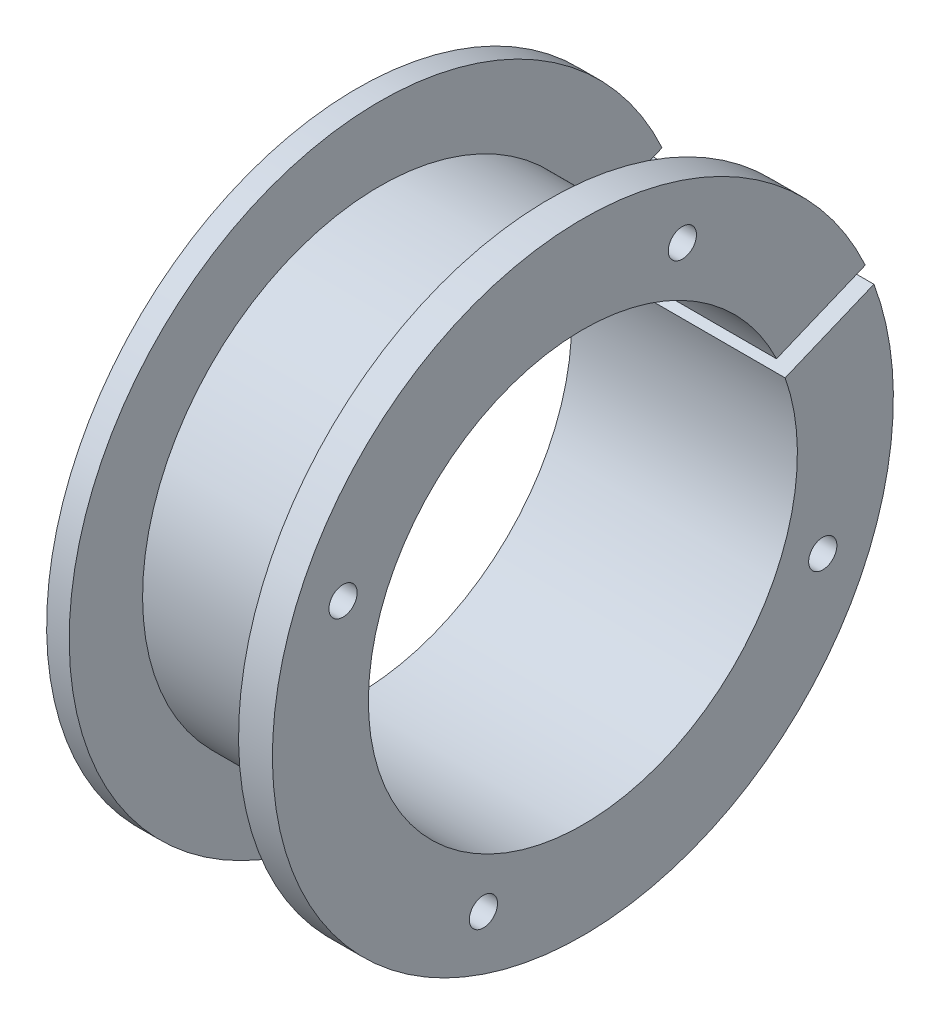
ISO-10303-21;
HEADER;
FILE_DESCRIPTION(('STEP AP214'),'2;1');
FILE_NAME('part.step','',(''),(''),'','','');
FILE_SCHEMA(('AUTOMOTIVE_DESIGN { 1 0 10303 214 1 1 1 1 }'));
ENDSEC;
DATA;
#1=APPLICATION_CONTEXT('core data for automotive mechanical design processes');
#2=APPLICATION_PROTOCOL_DEFINITION('international standard','automotive_design',2000,#1);
#3=PRODUCT_CONTEXT('',#1,'mechanical');
#4=PRODUCT('Part','Part','',(#3));
#5=PRODUCT_RELATED_PRODUCT_CATEGORY('part','',(#4));
#6=PRODUCT_DEFINITION_FORMATION('','',#4);
#7=PRODUCT_DEFINITION_CONTEXT('part definition',#1,'design');
#8=PRODUCT_DEFINITION('design','',#6,#7);
#9=PRODUCT_DEFINITION_SHAPE('','',#8);
#10=(LENGTH_UNIT() NAMED_UNIT(*) SI_UNIT(.MILLI.,.METRE.));
#11=(NAMED_UNIT(*) PLANE_ANGLE_UNIT() SI_UNIT($,.RADIAN.));
#12=(NAMED_UNIT(*) SI_UNIT($,.STERADIAN.) SOLID_ANGLE_UNIT());
#13=UNCERTAINTY_MEASURE_WITH_UNIT(LENGTH_MEASURE(1.E-05),#10,'distance_accuracy_value','');
#14=(GEOMETRIC_REPRESENTATION_CONTEXT(3) GLOBAL_UNCERTAINTY_ASSIGNED_CONTEXT((#13)) GLOBAL_UNIT_ASSIGNED_CONTEXT((#10,
#11,#12)) REPRESENTATION_CONTEXT('',''));
#15=CARTESIAN_POINT('',(0.,0.,0.));
#16=DIRECTION('',(0.,0.,1.));
#17=DIRECTION('',(1.,0.,0.));
#18=AXIS2_PLACEMENT_3D('',#15,#16,#17);
#19=CARTESIAN_POINT('',(0.,19.,0.));
#20=DIRECTION('',(1.,0.,0.));
#21=DIRECTION('',(0.,0.,-1.));
#22=AXIS2_PLACEMENT_3D('',#19,#20,#21);
#23=PLANE('',#22);
#24=DIRECTION('',(0.,0.382317796738247,-0.92403089899484));
#25=VECTOR('',#24,1.);
#26=CARTESIAN_POINT('',(0.,11.4377703092966,-25.0285319256198));
#27=LINE('',#26,#25);
#28=CARTESIAN_POINT('',(0.,8.17800106525573,-17.1499358184419));
#29=VERTEX_POINT('',#28);
#30=CARTESIAN_POINT('',(0.,11.43081677718,-25.0117258062402));
#31=VERTEX_POINT('',#30);
#32=EDGE_CURVE('E57',#29,#31,#27,.T.);
#33=ORIENTED_EDGE('',*,*,#32,.T.);
#34=CARTESIAN_POINT('',(0.,0.,0.));
#35=DIRECTION('',(1.,0.,0.));
#36=DIRECTION('',(0.,0.,-1.));
#37=AXIS2_PLACEMENT_3D('',#34,#35,#36);
#38=CIRCLE('',#37,27.5);
#39=CARTESIAN_POINT('',(0.,9.58275497919029,-25.7763613997167));
#40=VERTEX_POINT('',#39);
#41=EDGE_CURVE('E11',#31,#40,#38,.T.);
#42=ORIENTED_EDGE('',*,*,#41,.T.);
#43=DIRECTION('',(0.,-0.382317796738246,0.92403089899484));
#44=VECTOR('',#43,1.);
#45=CARTESIAN_POINT('',(0.,9.58970851130696,-25.7931675190963));
#46=LINE('',#45,#44);
#47=CARTESIAN_POINT('',(0.,6.3299392672661,-17.9145714119184));
#48=VERTEX_POINT('',#47);
#49=EDGE_CURVE('E99',#40,#48,#46,.T.);
#50=ORIENTED_EDGE('',*,*,#49,.T.);
#51=CARTESIAN_POINT('',(0.,0.,0.));
#52=DIRECTION('',(1.,0.,0.));
#53=DIRECTION('',(0.,0.,-1.));
#54=AXIS2_PLACEMENT_3D('',#51,#52,#53);
#55=CIRCLE('',#54,19.);
#56=EDGE_CURVE('E110',#29,#48,#55,.T.);
#57=ORIENTED_EDGE('',*,*,#56,.F.);
#58=EDGE_LOOP('',(#33,#42,#50,#57));
#59=FACE_BOUND('',#58,.T.);
#60=CARTESIAN_POINT('',(0.,-21.2457444909825,8.81012718545448));
#61=DIRECTION('',(1.,0.,0.));
#62=DIRECTION('',(0.,0.,-1.));
#63=AXIS2_PLACEMENT_3D('',#60,#61,#62);
#64=CIRCLE('',#63,1.24999999999999);
#65=CARTESIAN_POINT('',(0.,-21.2457444909825,7.56012718545449));
#66=VERTEX_POINT('',#65);
#67=EDGE_CURVE('E152',#66,#66,#64,.T.);
#68=ORIENTED_EDGE('',*,*,#67,.F.);
#69=EDGE_LOOP('',(#68));
#70=FACE_BOUND('',#69,.T.);
#71=CARTESIAN_POINT('',(0.,-8.81012718545447,-21.2457444909825));
#72=DIRECTION('',(1.,0.,0.));
#73=DIRECTION('',(0.,0.,-1.));
#74=AXIS2_PLACEMENT_3D('',#71,#72,#73);
#75=CIRCLE('',#74,1.24999999999999);
#76=CARTESIAN_POINT('',(0.,-8.81012718545447,-22.4957444909825));
#77=VERTEX_POINT('',#76);
#78=EDGE_CURVE('E143',#77,#77,#75,.T.);
#79=ORIENTED_EDGE('',*,*,#78,.F.);
#80=EDGE_LOOP('',(#79));
#81=FACE_BOUND('',#80,.T.);
#82=CARTESIAN_POINT('',(0.,21.2457444909826,-8.81012718545444));
#83=DIRECTION('',(1.,0.,0.));
#84=DIRECTION('',(0.,0.,-1.));
#85=AXIS2_PLACEMENT_3D('',#82,#83,#84);
#86=CIRCLE('',#85,1.24999999999999);
#87=CARTESIAN_POINT('',(0.,21.2457444909826,-10.0601271854544));
#88=VERTEX_POINT('',#87);
#89=EDGE_CURVE('E140',#88,#88,#86,.T.);
#90=ORIENTED_EDGE('',*,*,#89,.F.);
#91=EDGE_LOOP('',(#90));
#92=FACE_BOUND('',#91,.T.);
#93=CARTESIAN_POINT('',(0.,8.81012718545446,21.2457444909826));
#94=DIRECTION('',(1.,0.,0.));
#95=DIRECTION('',(0.,0.,-1.));
#96=AXIS2_PLACEMENT_3D('',#93,#94,#95);
#97=CIRCLE('',#96,1.24999999999999);
#98=CARTESIAN_POINT('',(0.,8.81012718545446,19.9957444909826));
#99=VERTEX_POINT('',#98);
#100=EDGE_CURVE('E120',#99,#99,#97,.T.);
#101=ORIENTED_EDGE('',*,*,#100,.F.);
#102=EDGE_LOOP('',(#101));
#103=FACE_BOUND('',#102,.T.);
#104=ADVANCED_FACE('F33',(#59,#70,#81,#92,#103),#23,.T.);
#105=CARTESIAN_POINT('',(0.,0.,0.));
#106=DIRECTION('',(1.,0.,0.));
#107=DIRECTION('',(0.,0.,-1.));
#108=AXIS2_PLACEMENT_3D('',#105,#106,#107);
#109=CYLINDRICAL_SURFACE('',#108,27.5);
#110=DIRECTION('',(1.,0.,0.));
#111=VECTOR('',#110,1.);
#112=CARTESIAN_POINT('',(0.,11.43081677718,-25.0117258062402));
#113=LINE('',#112,#111);
#114=CARTESIAN_POINT('',(-3.,11.43081677718,-25.0117258062402));
#115=VERTEX_POINT('',#114);
#116=EDGE_CURVE('E156',#115,#31,#113,.T.);
#117=ORIENTED_EDGE('',*,*,#116,.F.);
#118=CARTESIAN_POINT('',(-3.,0.,0.));
#119=DIRECTION('',(1.,0.,0.));
#120=DIRECTION('',(0.,0.,-1.));
#121=AXIS2_PLACEMENT_3D('',#118,#119,#120);
#122=CIRCLE('',#121,27.5);
#123=CARTESIAN_POINT('',(-3.,9.5827549791903,-25.7763613997167));
#124=VERTEX_POINT('',#123);
#125=EDGE_CURVE('E41',#115,#124,#122,.T.);
#126=ORIENTED_EDGE('',*,*,#125,.T.);
#127=DIRECTION('',(1.,0.,0.));
#128=VECTOR('',#127,1.);
#129=CARTESIAN_POINT('',(0.,9.58275497919029,-25.7763613997167));
#130=LINE('',#129,#128);
#131=EDGE_CURVE('E166',#40,#124,#130,.F.);
#132=ORIENTED_EDGE('',*,*,#131,.F.);
#133=ORIENTED_EDGE('',*,*,#41,.F.);
#134=EDGE_LOOP('',(#117,#126,#132,#133));
#135=FACE_BOUND('',#134,.T.);
#136=ADVANCED_FACE('F182',(#135),#109,.T.);
#137=CARTESIAN_POINT('',(-3.,27.5,0.));
#138=DIRECTION('',(-1.,0.,0.));
#139=DIRECTION('',(0.,0.,1.));
#140=AXIS2_PLACEMENT_3D('',#137,#138,#139);
#141=PLANE('',#140);
#142=DIRECTION('',(0.,0.382317796738247,-0.92403089899484));
#143=VECTOR('',#142,1.);
#144=CARTESIAN_POINT('',(-3.,4.94362058582151,-9.33270228236041));
#145=LINE('',#144,#143);
#146=CARTESIAN_POINT('',(-3.,8.94359665963467,-19.0003178602299));
#147=VERTEX_POINT('',#146);
#148=EDGE_CURVE('E158',#147,#115,#145,.T.);
#149=ORIENTED_EDGE('',*,*,#148,.F.);
#150=CARTESIAN_POINT('',(-3.,0.,0.));
#151=DIRECTION('',(1.,0.,0.));
#152=DIRECTION('',(0.,0.,-1.));
#153=AXIS2_PLACEMENT_3D('',#150,#151,#152);
#154=CIRCLE('',#153,21.);
#155=CARTESIAN_POINT('',(-3.,7.095534861645,-19.7649534537064));
#156=VERTEX_POINT('',#155);
#157=EDGE_CURVE('E133',#147,#156,#154,.T.);
#158=ORIENTED_EDGE('',*,*,#157,.T.);
#159=DIRECTION('',(0.,-0.382317796738246,0.924030898994841));
#160=VECTOR('',#159,1.);
#161=CARTESIAN_POINT('',(-3.,3.09555878783184,-10.0973378758369));
#162=LINE('',#161,#160);
#163=EDGE_CURVE('E168',#124,#156,#162,.T.);
#164=ORIENTED_EDGE('',*,*,#163,.F.);
#165=ORIENTED_EDGE('',*,*,#125,.F.);
#166=EDGE_LOOP('',(#149,#158,#164,#165));
#167=FACE_BOUND('',#166,.T.);
#168=CARTESIAN_POINT('',(-3.,-21.2457444909825,8.81012718545448));
#169=DIRECTION('',(-1.,0.,0.));
#170=DIRECTION('',(0.,0.,1.));
#171=AXIS2_PLACEMENT_3D('',#168,#169,#170);
#172=CIRCLE('',#171,1.24999999999999);
#173=CARTESIAN_POINT('',(-3.,-21.2457444909825,10.0601271854545));
#174=VERTEX_POINT('',#173);
#175=EDGE_CURVE('E36',#174,#174,#172,.T.);
#176=ORIENTED_EDGE('',*,*,#175,.F.);
#177=EDGE_LOOP('',(#176));
#178=FACE_BOUND('',#177,.T.);
#179=CARTESIAN_POINT('',(-3.,-8.81012718545447,-21.2457444909825));
#180=DIRECTION('',(-1.,0.,0.));
#181=DIRECTION('',(0.,0.,1.));
#182=AXIS2_PLACEMENT_3D('',#179,#180,#181);
#183=CIRCLE('',#182,1.24999999999999);
#184=CARTESIAN_POINT('',(-3.,-8.81012718545447,-19.9957444909825));
#185=VERTEX_POINT('',#184);
#186=EDGE_CURVE('E141',#185,#185,#183,.T.);
#187=ORIENTED_EDGE('',*,*,#186,.F.);
#188=EDGE_LOOP('',(#187));
#189=FACE_BOUND('',#188,.T.);
#190=CARTESIAN_POINT('',(-3.,21.2457444909826,-8.81012718545444));
#191=DIRECTION('',(-1.,0.,0.));
#192=DIRECTION('',(0.,0.,1.));
#193=AXIS2_PLACEMENT_3D('',#190,#191,#192);
#194=CIRCLE('',#193,1.24999999999999);
#195=CARTESIAN_POINT('',(-3.,21.2457444909826,-7.56012718545446));
#196=VERTEX_POINT('',#195);
#197=EDGE_CURVE('E138',#196,#196,#194,.T.);
#198=ORIENTED_EDGE('',*,*,#197,.F.);
#199=EDGE_LOOP('',(#198));
#200=FACE_BOUND('',#199,.T.);
#201=CARTESIAN_POINT('',(-3.,8.81012718545446,21.2457444909826));
#202=DIRECTION('',(-1.,0.,0.));
#203=DIRECTION('',(0.,0.,1.));
#204=AXIS2_PLACEMENT_3D('',#201,#202,#203);
#205=CIRCLE('',#204,1.24999999999999);
#206=CARTESIAN_POINT('',(-3.,8.81012718545446,22.4957444909826));
#207=VERTEX_POINT('',#206);
#208=EDGE_CURVE('E115',#207,#207,#205,.T.);
#209=ORIENTED_EDGE('',*,*,#208,.F.);
#210=EDGE_LOOP('',(#209));
#211=FACE_BOUND('',#210,.T.);
#212=ADVANCED_FACE('F188',(#167,#178,#189,#200,#211),#141,.T.);
#213=CARTESIAN_POINT('',(0.,0.,0.));
#214=DIRECTION('',(1.,0.,0.));
#215=DIRECTION('',(0.,0.,-1.));
#216=AXIS2_PLACEMENT_3D('',#213,#214,#215);
#217=CYLINDRICAL_SURFACE('',#216,21.);
#218=DIRECTION('',(1.,0.,0.));
#219=VECTOR('',#218,1.);
#220=CARTESIAN_POINT('',(0.,8.94359665963467,-19.0003178602299));
#221=LINE('',#220,#219);
#222=CARTESIAN_POINT('',(-18.,8.94359665963467,-19.0003178602299));
#223=VERTEX_POINT('',#222);
#224=EDGE_CURVE('E160',#223,#147,#221,.T.);
#225=ORIENTED_EDGE('',*,*,#224,.F.);
#226=CARTESIAN_POINT('',(-18.,0.,0.));
#227=DIRECTION('',(1.,0.,0.));
#228=DIRECTION('',(0.,0.,-1.));
#229=AXIS2_PLACEMENT_3D('',#226,#227,#228);
#230=CIRCLE('',#229,21.);
#231=CARTESIAN_POINT('',(-18.,7.09553486164499,-19.7649534537064));
#232=VERTEX_POINT('',#231);
#233=EDGE_CURVE('E130',#223,#232,#230,.T.);
#234=ORIENTED_EDGE('',*,*,#233,.T.);
#235=DIRECTION('',(1.,0.,0.));
#236=VECTOR('',#235,1.);
#237=CARTESIAN_POINT('',(0.,7.095534861645,-19.7649534537064));
#238=LINE('',#237,#236);
#239=EDGE_CURVE('E170',#156,#232,#238,.F.);
#240=ORIENTED_EDGE('',*,*,#239,.F.);
#241=ORIENTED_EDGE('',*,*,#157,.F.);
#242=EDGE_LOOP('',(#225,#234,#240,#241));
#243=FACE_BOUND('',#242,.T.);
#244=ADVANCED_FACE('F193',(#243),#217,.T.);
#245=CARTESIAN_POINT('',(-18.,21.,0.));
#246=DIRECTION('',(1.,0.,0.));
#247=DIRECTION('',(0.,0.,-1.));
#248=AXIS2_PLACEMENT_3D('',#245,#246,#247);
#249=PLANE('',#248);
#250=DIRECTION('',(0.,-0.382317796738247,0.92403089899484));
#251=VECTOR('',#250,1.);
#252=CARTESIAN_POINT('',(-18.,3.99353575075339,-7.0364248091189));
#253=LINE('',#252,#251);
#254=CARTESIAN_POINT('',(-18.,11.43081677718,-25.0117258062402));
#255=VERTEX_POINT('',#254);
#256=EDGE_CURVE('E162',#255,#223,#253,.T.);
#257=ORIENTED_EDGE('',*,*,#256,.F.);
#258=CARTESIAN_POINT('',(-18.,0.,0.));
#259=DIRECTION('',(1.,0.,0.));
#260=DIRECTION('',(0.,0.,-1.));
#261=AXIS2_PLACEMENT_3D('',#258,#259,#260);
#262=CIRCLE('',#261,27.5);
#263=CARTESIAN_POINT('',(-18.,9.58275497919029,-25.7763613997167));
#264=VERTEX_POINT('',#263);
#265=EDGE_CURVE('E127',#255,#264,#262,.T.);
#266=ORIENTED_EDGE('',*,*,#265,.T.);
#267=DIRECTION('',(0.,0.382317796738246,-0.924030898994841));
#268=VECTOR('',#267,1.);
#269=CARTESIAN_POINT('',(-18.,2.14547395276372,-7.80106040259537));
#270=LINE('',#269,#268);
#271=EDGE_CURVE('E172',#232,#264,#270,.T.);
#272=ORIENTED_EDGE('',*,*,#271,.F.);
#273=ORIENTED_EDGE('',*,*,#233,.F.);
#274=EDGE_LOOP('',(#257,#266,#272,#273));
#275=FACE_BOUND('',#274,.T.);
#276=ADVANCED_FACE('F199',(#275),#249,.T.);
#277=CARTESIAN_POINT('',(0.,0.,0.));
#278=DIRECTION('',(1.,0.,0.));
#279=DIRECTION('',(0.,0.,-1.));
#280=AXIS2_PLACEMENT_3D('',#277,#278,#279);
#281=CYLINDRICAL_SURFACE('',#280,27.5);
#282=DIRECTION('',(1.,0.,0.));
#283=VECTOR('',#282,1.);
#284=CARTESIAN_POINT('',(0.,11.43081677718,-25.0117258062402));
#285=LINE('',#284,#283);
#286=CARTESIAN_POINT('',(-20.,11.43081677718,-25.0117258062402));
#287=VERTEX_POINT('',#286);
#288=EDGE_CURVE('E164',#287,#255,#285,.T.);
#289=ORIENTED_EDGE('',*,*,#288,.F.);
#290=CARTESIAN_POINT('',(-20.,0.,0.));
#291=DIRECTION('',(1.,0.,0.));
#292=DIRECTION('',(0.,0.,-1.));
#293=AXIS2_PLACEMENT_3D('',#290,#291,#292);
#294=CIRCLE('',#293,27.5);
#295=CARTESIAN_POINT('',(-20.,9.5827549791903,-25.7763613997167));
#296=VERTEX_POINT('',#295);
#297=EDGE_CURVE('E117',#287,#296,#294,.T.);
#298=ORIENTED_EDGE('',*,*,#297,.T.);
#299=DIRECTION('',(1.,0.,0.));
#300=VECTOR('',#299,1.);
#301=CARTESIAN_POINT('',(0.,9.58275497919029,-25.7763613997167));
#302=LINE('',#301,#300);
#303=EDGE_CURVE('E174',#264,#296,#302,.F.);
#304=ORIENTED_EDGE('',*,*,#303,.F.);
#305=ORIENTED_EDGE('',*,*,#265,.F.);
#306=EDGE_LOOP('',(#289,#298,#304,#305));
#307=FACE_BOUND('',#306,.T.);
#308=ADVANCED_FACE('F203',(#307),#281,.T.);
#309=CARTESIAN_POINT('',(-20.,27.5,0.));
#310=DIRECTION('',(-1.,0.,0.));
#311=DIRECTION('',(0.,0.,1.));
#312=AXIS2_PLACEMENT_3D('',#309,#310,#311);
#313=PLANE('',#312);
#314=DIRECTION('',(0.,0.382317796738247,-0.92403089899484));
#315=VECTOR('',#314,1.);
#316=CARTESIAN_POINT('',(-20.,11.4377703092966,-25.0285319256198));
#317=LINE('',#316,#315);
#318=CARTESIAN_POINT('',(-20.,8.17800106525577,-17.1499358184419));
#319=VERTEX_POINT('',#318);
#320=EDGE_CURVE('E178',#319,#287,#317,.T.);
#321=ORIENTED_EDGE('',*,*,#320,.F.);
#322=CARTESIAN_POINT('',(-20.,0.,0.));
#323=DIRECTION('',(1.,0.,0.));
#324=DIRECTION('',(0.,0.,-1.));
#325=AXIS2_PLACEMENT_3D('',#322,#323,#324);
#326=CIRCLE('',#325,19.);
#327=CARTESIAN_POINT('',(-20.,6.32993926726608,-17.9145714119184));
#328=VERTEX_POINT('',#327);
#329=EDGE_CURVE('E114',#319,#328,#326,.T.);
#330=ORIENTED_EDGE('',*,*,#329,.T.);
#331=DIRECTION('',(0.,-0.382317796738246,0.92403089899484));
#332=VECTOR('',#331,1.);
#333=CARTESIAN_POINT('',(-20.,9.58970851130696,-25.7931675190963));
#334=LINE('',#333,#332);
#335=EDGE_CURVE('E49',#296,#328,#334,.T.);
#336=ORIENTED_EDGE('',*,*,#335,.F.);
#337=ORIENTED_EDGE('',*,*,#297,.F.);
#338=EDGE_LOOP('',(#321,#330,#336,#337));
#339=FACE_BOUND('',#338,.T.);
#340=ADVANCED_FACE('F207',(#339),#313,.T.);
#341=CARTESIAN_POINT('',(0.,0.,0.));
#342=DIRECTION('',(1.,0.,0.));
#343=DIRECTION('',(0.,0.,-1.));
#344=AXIS2_PLACEMENT_3D('',#341,#342,#343);
#345=CYLINDRICAL_SURFACE('',#344,19.);
#346=DIRECTION('',(-1.,0.,0.));
#347=VECTOR('',#346,1.);
#348=CARTESIAN_POINT('',(0.,8.17800106525577,-17.1499358184419));
#349=LINE('',#348,#347);
#350=EDGE_CURVE('E105',#29,#319,#349,.T.);
#351=ORIENTED_EDGE('',*,*,#350,.F.);
#352=ORIENTED_EDGE('',*,*,#56,.T.);
#353=DIRECTION('',(-1.,0.,0.));
#354=VECTOR('',#353,1.);
#355=CARTESIAN_POINT('',(0.,6.3299392672661,-17.9145714119184));
#356=LINE('',#355,#354);
#357=EDGE_CURVE('E96',#48,#328,#356,.T.);
#358=ORIENTED_EDGE('',*,*,#357,.T.);
#359=ORIENTED_EDGE('',*,*,#329,.F.);
#360=EDGE_LOOP('',(#351,#352,#358,#359));
#361=FACE_BOUND('',#360,.T.);
#362=ADVANCED_FACE('F113',(#361),#345,.F.);
#363=CARTESIAN_POINT('',(0.,8.81012718545446,21.2457444909826));
#364=DIRECTION('',(1.,0.,0.));
#365=DIRECTION('',(0.,0.,-1.));
#366=AXIS2_PLACEMENT_3D('',#363,#364,#365);
#367=CYLINDRICAL_SURFACE('',#366,1.24999999999999);
#368=ORIENTED_EDGE('',*,*,#208,.T.);
#369=EDGE_LOOP('',(#368));
#370=FACE_BOUND('',#369,.T.);
#371=ORIENTED_EDGE('',*,*,#100,.T.);
#372=EDGE_LOOP('',(#371));
#373=FACE_BOUND('',#372,.T.);
#374=ADVANCED_FACE('F236',(#370,#373),#367,.F.);
#375=CARTESIAN_POINT('',(0.,21.2457444909826,-8.81012718545444));
#376=DIRECTION('',(1.,0.,0.));
#377=DIRECTION('',(0.,0.,-1.));
#378=AXIS2_PLACEMENT_3D('',#375,#376,#377);
#379=CYLINDRICAL_SURFACE('',#378,1.24999999999999);
#380=ORIENTED_EDGE('',*,*,#197,.T.);
#381=EDGE_LOOP('',(#380));
#382=FACE_BOUND('',#381,.T.);
#383=ORIENTED_EDGE('',*,*,#89,.T.);
#384=EDGE_LOOP('',(#383));
#385=FACE_BOUND('',#384,.T.);
#386=ADVANCED_FACE('F239',(#382,#385),#379,.F.);
#387=CARTESIAN_POINT('',(0.,-8.81012718545447,-21.2457444909825));
#388=DIRECTION('',(1.,0.,0.));
#389=DIRECTION('',(0.,0.,-1.));
#390=AXIS2_PLACEMENT_3D('',#387,#388,#389);
#391=CYLINDRICAL_SURFACE('',#390,1.24999999999999);
#392=ORIENTED_EDGE('',*,*,#186,.T.);
#393=EDGE_LOOP('',(#392));
#394=FACE_BOUND('',#393,.T.);
#395=ORIENTED_EDGE('',*,*,#78,.T.);
#396=EDGE_LOOP('',(#395));
#397=FACE_BOUND('',#396,.T.);
#398=ADVANCED_FACE('F243',(#394,#397),#391,.F.);
#399=CARTESIAN_POINT('',(0.,-21.2457444909825,8.81012718545448));
#400=DIRECTION('',(1.,0.,0.));
#401=DIRECTION('',(0.,0.,-1.));
#402=AXIS2_PLACEMENT_3D('',#399,#400,#401);
#403=CYLINDRICAL_SURFACE('',#402,1.24999999999999);
#404=ORIENTED_EDGE('',*,*,#175,.T.);
#405=EDGE_LOOP('',(#404));
#406=FACE_BOUND('',#405,.T.);
#407=ORIENTED_EDGE('',*,*,#67,.T.);
#408=EDGE_LOOP('',(#407));
#409=FACE_BOUND('',#408,.T.);
#410=ADVANCED_FACE('F214',(#406,#409),#403,.F.);
#411=CARTESIAN_POINT('',(0.,9.58970851130696,-25.7931675190963));
#412=DIRECTION('',(0.,-0.92403089899484,-0.382317796738246));
#413=DIRECTION('',(0.,0.382317796738246,-0.924030898994841));
#414=AXIS2_PLACEMENT_3D('',#411,#412,#413);
#415=PLANE('',#414);
#416=ORIENTED_EDGE('',*,*,#131,.T.);
#417=ORIENTED_EDGE('',*,*,#163,.T.);
#418=ORIENTED_EDGE('',*,*,#239,.T.);
#419=ORIENTED_EDGE('',*,*,#271,.T.);
#420=ORIENTED_EDGE('',*,*,#303,.T.);
#421=ORIENTED_EDGE('',*,*,#335,.T.);
#422=ORIENTED_EDGE('',*,*,#357,.F.);
#423=ORIENTED_EDGE('',*,*,#49,.F.);
#424=EDGE_LOOP('',(#416,#417,#418,#419,#420,#421,#422,#423));
#425=FACE_BOUND('',#424,.T.);
#426=ADVANCED_FACE('F98',(#425),#415,.F.);
#427=CARTESIAN_POINT('',(0.,11.4377703092966,-25.0285319256198));
#428=DIRECTION('',(0.,0.92403089899484,0.382317796738247));
#429=DIRECTION('',(0.,-0.382317796738247,0.92403089899484));
#430=AXIS2_PLACEMENT_3D('',#427,#428,#429);
#431=PLANE('',#430);
#432=ORIENTED_EDGE('',*,*,#116,.T.);
#433=ORIENTED_EDGE('',*,*,#32,.F.);
#434=ORIENTED_EDGE('',*,*,#350,.T.);
#435=ORIENTED_EDGE('',*,*,#320,.T.);
#436=ORIENTED_EDGE('',*,*,#288,.T.);
#437=ORIENTED_EDGE('',*,*,#256,.T.);
#438=ORIENTED_EDGE('',*,*,#224,.T.);
#439=ORIENTED_EDGE('',*,*,#148,.T.);
#440=EDGE_LOOP('',(#432,#433,#434,#435,#436,#437,#438,#439));
#441=FACE_BOUND('',#440,.T.);
#442=ADVANCED_FACE('F208',(#441),#431,.F.);
#443=CLOSED_SHELL('',(#104,#136,#212,#244,#276,#308,#340,#362,#374,#386,#398,#410,#426,#442));
#444=MANIFOLD_SOLID_BREP('B2',#443);
#445=ADVANCED_BREP_SHAPE_REPRESENTATION('',(#18,#444),#14);
#446=SHAPE_DEFINITION_REPRESENTATION(#9,#445);
ENDSEC;
END-ISO-10303-21;
